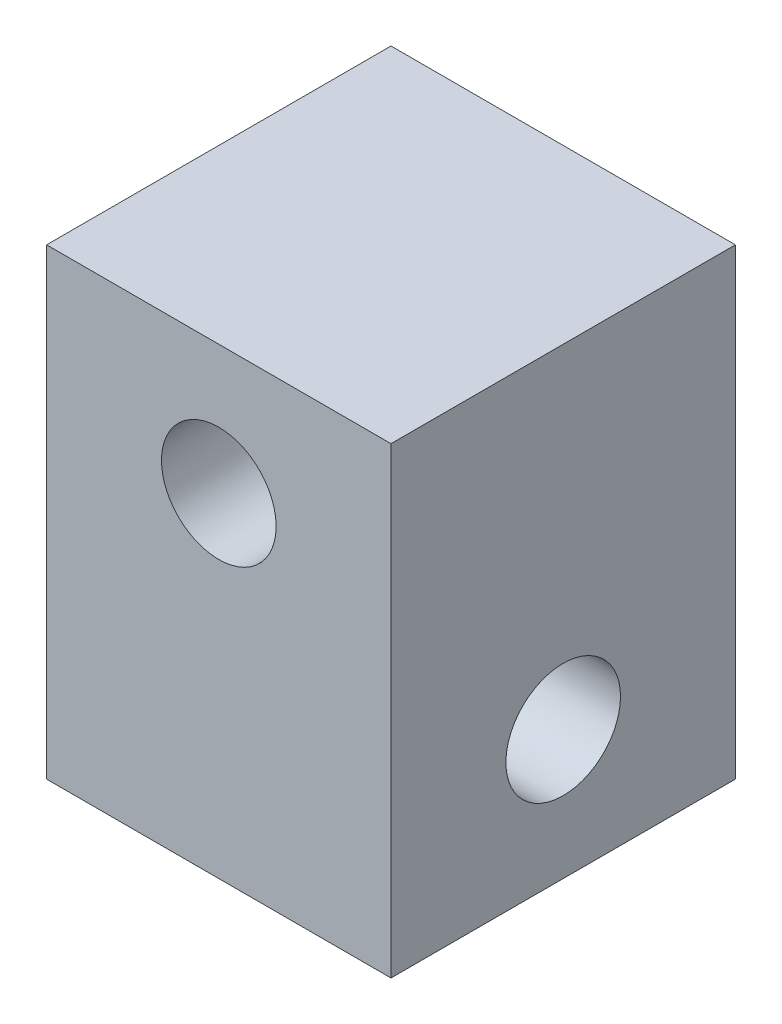
ISO-10303-21;
HEADER;
FILE_DESCRIPTION(('STEP AP214'),'2;1');
FILE_NAME('part.step','',(''),(''),'','','');
FILE_SCHEMA(('AUTOMOTIVE_DESIGN { 1 0 10303 214 1 1 1 1 }'));
ENDSEC;
DATA;
#1=APPLICATION_CONTEXT('core data for automotive mechanical design processes');
#2=APPLICATION_PROTOCOL_DEFINITION('international standard','automotive_design',2000,#1);
#3=PRODUCT_CONTEXT('',#1,'mechanical');
#4=PRODUCT('Part','Part','',(#3));
#5=PRODUCT_RELATED_PRODUCT_CATEGORY('part','',(#4));
#6=PRODUCT_DEFINITION_FORMATION('','',#4);
#7=PRODUCT_DEFINITION_CONTEXT('part definition',#1,'design');
#8=PRODUCT_DEFINITION('design','',#6,#7);
#9=PRODUCT_DEFINITION_SHAPE('','',#8);
#10=(LENGTH_UNIT() NAMED_UNIT(*) SI_UNIT(.MILLI.,.METRE.));
#11=(NAMED_UNIT(*) PLANE_ANGLE_UNIT() SI_UNIT($,.RADIAN.));
#12=(NAMED_UNIT(*) SI_UNIT($,.STERADIAN.) SOLID_ANGLE_UNIT());
#13=UNCERTAINTY_MEASURE_WITH_UNIT(LENGTH_MEASURE(1.E-05),#10,'distance_accuracy_value','');
#14=(GEOMETRIC_REPRESENTATION_CONTEXT(3) GLOBAL_UNCERTAINTY_ASSIGNED_CONTEXT((#13)) GLOBAL_UNIT_ASSIGNED_CONTEXT((#10,
#11,#12)) REPRESENTATION_CONTEXT('',''));
#15=CARTESIAN_POINT('',(0.,0.,0.));
#16=DIRECTION('',(0.,0.,1.));
#17=DIRECTION('',(1.,0.,0.));
#18=AXIS2_PLACEMENT_3D('',#15,#16,#17);
#19=CARTESIAN_POINT('',(4.064,0.,-4.064));
#20=DIRECTION('',(0.,-1.,0.));
#21=DIRECTION('',(0.,0.,-1.));
#22=AXIS2_PLACEMENT_3D('',#19,#20,#21);
#23=PLANE('',#22);
#24=DIRECTION('',(0.,0.,1.));
#25=VECTOR('',#24,1.);
#26=CARTESIAN_POINT('',(-4.064,0.,-4.064));
#27=LINE('',#26,#25);
#28=CARTESIAN_POINT('',(-4.064,0.,-4.064));
#29=VERTEX_POINT('',#28);
#30=CARTESIAN_POINT('',(-4.064,0.,4.064));
#31=VERTEX_POINT('',#30);
#32=EDGE_CURVE('E97',#29,#31,#27,.T.);
#33=ORIENTED_EDGE('',*,*,#32,.F.);
#34=DIRECTION('',(-1.,0.,0.));
#35=VECTOR('',#34,1.);
#36=CARTESIAN_POINT('',(4.064,0.,-4.064));
#37=LINE('',#36,#35);
#38=CARTESIAN_POINT('',(4.064,0.,-4.064));
#39=VERTEX_POINT('',#38);
#40=EDGE_CURVE('E11',#39,#29,#37,.T.);
#41=ORIENTED_EDGE('',*,*,#40,.F.);
#42=DIRECTION('',(0.,0.,1.));
#43=VECTOR('',#42,1.);
#44=CARTESIAN_POINT('',(4.064,0.,-4.064));
#45=LINE('',#44,#43);
#46=CARTESIAN_POINT('',(4.064,0.,4.064));
#47=VERTEX_POINT('',#46);
#48=EDGE_CURVE('E90',#39,#47,#45,.T.);
#49=ORIENTED_EDGE('',*,*,#48,.T.);
#50=DIRECTION('',(-1.,0.,0.));
#51=VECTOR('',#50,1.);
#52=CARTESIAN_POINT('',(4.064,0.,4.064));
#53=LINE('',#52,#51);
#54=EDGE_CURVE('E35',#47,#31,#53,.T.);
#55=ORIENTED_EDGE('',*,*,#54,.T.);
#56=EDGE_LOOP('',(#33,#41,#49,#55));
#57=FACE_BOUND('',#56,.T.);
#58=ADVANCED_FACE('F32',(#57),#23,.T.);
#59=CARTESIAN_POINT('',(4.064,10.922,-4.064));
#60=DIRECTION('',(0.,0.,-1.));
#61=DIRECTION('',(-1.,0.,0.));
#62=AXIS2_PLACEMENT_3D('',#59,#60,#61);
#63=PLANE('',#62);
#64=CARTESIAN_POINT('',(0.,7.874,-4.064));
#65=DIRECTION('',(0.,0.,1.));
#66=DIRECTION('',(1.,0.,0.));
#67=AXIS2_PLACEMENT_3D('',#64,#65,#66);
#68=CIRCLE('',#67,1.35254999999998);
#69=CARTESIAN_POINT('',(1.35254999999998,7.874,-4.064));
#70=VERTEX_POINT('',#69);
#71=EDGE_CURVE('E130',#70,#70,#68,.T.);
#72=ORIENTED_EDGE('',*,*,#71,.T.);
#73=EDGE_LOOP('',(#72));
#74=FACE_BOUND('',#73,.T.);
#75=DIRECTION('',(0.,-1.,0.));
#76=VECTOR('',#75,1.);
#77=CARTESIAN_POINT('',(-4.064,10.922,-4.064));
#78=LINE('',#77,#76);
#79=CARTESIAN_POINT('',(-4.064,10.922,-4.064));
#80=VERTEX_POINT('',#79);
#81=EDGE_CURVE('E92',#80,#29,#78,.T.);
#82=ORIENTED_EDGE('',*,*,#81,.F.);
#83=DIRECTION('',(-1.,0.,0.));
#84=VECTOR('',#83,1.);
#85=CARTESIAN_POINT('',(4.064,10.922,-4.064));
#86=LINE('',#85,#84);
#87=CARTESIAN_POINT('',(4.064,10.922,-4.064));
#88=VERTEX_POINT('',#87);
#89=EDGE_CURVE('E41',#88,#80,#86,.T.);
#90=ORIENTED_EDGE('',*,*,#89,.F.);
#91=DIRECTION('',(0.,-1.,0.));
#92=VECTOR('',#91,1.);
#93=CARTESIAN_POINT('',(4.064,10.922,-4.064));
#94=LINE('',#93,#92);
#95=EDGE_CURVE('E87',#88,#39,#94,.T.);
#96=ORIENTED_EDGE('',*,*,#95,.T.);
#97=ORIENTED_EDGE('',*,*,#40,.T.);
#98=EDGE_LOOP('',(#82,#90,#96,#97));
#99=FACE_BOUND('',#98,.T.);
#100=ADVANCED_FACE('F108',(#74,#99),#63,.T.);
#101=CARTESIAN_POINT('',(4.064,10.922,4.064));
#102=DIRECTION('',(0.,1.,0.));
#103=DIRECTION('',(0.,0.,1.));
#104=AXIS2_PLACEMENT_3D('',#101,#102,#103);
#105=PLANE('',#104);
#106=DIRECTION('',(0.,0.,-1.));
#107=VECTOR('',#106,1.);
#108=CARTESIAN_POINT('',(-4.064,10.922,4.064));
#109=LINE('',#108,#107);
#110=CARTESIAN_POINT('',(-4.064,10.922,4.064));
#111=VERTEX_POINT('',#110);
#112=EDGE_CURVE('E82',#111,#80,#109,.T.);
#113=ORIENTED_EDGE('',*,*,#112,.F.);
#114=DIRECTION('',(-1.,0.,0.));
#115=VECTOR('',#114,1.);
#116=CARTESIAN_POINT('',(4.064,10.922,4.064));
#117=LINE('',#116,#115);
#118=CARTESIAN_POINT('',(4.064,10.922,4.064));
#119=VERTEX_POINT('',#118);
#120=EDGE_CURVE('E77',#119,#111,#117,.T.);
#121=ORIENTED_EDGE('',*,*,#120,.F.);
#122=DIRECTION('',(0.,0.,-1.));
#123=VECTOR('',#122,1.);
#124=CARTESIAN_POINT('',(4.064,10.922,4.064));
#125=LINE('',#124,#123);
#126=EDGE_CURVE('E80',#119,#88,#125,.T.);
#127=ORIENTED_EDGE('',*,*,#126,.T.);
#128=ORIENTED_EDGE('',*,*,#89,.T.);
#129=EDGE_LOOP('',(#113,#121,#127,#128));
#130=FACE_BOUND('',#129,.T.);
#131=ADVANCED_FACE('F79',(#130),#105,.T.);
#132=CARTESIAN_POINT('',(4.064,0.,4.064));
#133=DIRECTION('',(0.,0.,1.));
#134=DIRECTION('',(1.,0.,0.));
#135=AXIS2_PLACEMENT_3D('',#132,#133,#134);
#136=PLANE('',#135);
#137=CARTESIAN_POINT('',(0.,7.874,4.064));
#138=DIRECTION('',(0.,0.,1.));
#139=DIRECTION('',(1.,0.,0.));
#140=AXIS2_PLACEMENT_3D('',#137,#138,#139);
#141=CIRCLE('',#140,1.35254999999998);
#142=CARTESIAN_POINT('',(1.35254999999998,7.874,4.064));
#143=VERTEX_POINT('',#142);
#144=EDGE_CURVE('E128',#143,#143,#141,.T.);
#145=ORIENTED_EDGE('',*,*,#144,.F.);
#146=EDGE_LOOP('',(#145));
#147=FACE_BOUND('',#146,.T.);
#148=DIRECTION('',(0.,1.,0.));
#149=VECTOR('',#148,1.);
#150=CARTESIAN_POINT('',(-4.064,0.,4.064));
#151=LINE('',#150,#149);
#152=EDGE_CURVE('E100',#31,#111,#151,.T.);
#153=ORIENTED_EDGE('',*,*,#152,.F.);
#154=ORIENTED_EDGE('',*,*,#54,.F.);
#155=DIRECTION('',(0.,1.,0.));
#156=VECTOR('',#155,1.);
#157=CARTESIAN_POINT('',(4.064,0.,4.064));
#158=LINE('',#157,#156);
#159=EDGE_CURVE('E86',#47,#119,#158,.T.);
#160=ORIENTED_EDGE('',*,*,#159,.T.);
#161=ORIENTED_EDGE('',*,*,#120,.T.);
#162=EDGE_LOOP('',(#153,#154,#160,#161));
#163=FACE_BOUND('',#162,.T.);
#164=ADVANCED_FACE('F89',(#147,#163),#136,.T.);
#165=CARTESIAN_POINT('',(4.064,0.,0.));
#166=DIRECTION('',(-1.,0.,0.));
#167=DIRECTION('',(0.,0.,1.));
#168=AXIS2_PLACEMENT_3D('',#165,#166,#167);
#169=PLANE('',#168);
#170=CARTESIAN_POINT('',(4.064,3.048,0.));
#171=DIRECTION('',(1.,0.,0.));
#172=DIRECTION('',(0.,0.,-1.));
#173=AXIS2_PLACEMENT_3D('',#170,#171,#172);
#174=CIRCLE('',#173,1.35254999999998);
#175=CARTESIAN_POINT('',(4.064,3.048,-1.35254999999998));
#176=VERTEX_POINT('',#175);
#177=EDGE_CURVE('E132',#176,#176,#174,.T.);
#178=ORIENTED_EDGE('',*,*,#177,.F.);
#179=EDGE_LOOP('',(#178));
#180=FACE_BOUND('',#179,.T.);
#181=ORIENTED_EDGE('',*,*,#48,.F.);
#182=ORIENTED_EDGE('',*,*,#95,.F.);
#183=ORIENTED_EDGE('',*,*,#126,.F.);
#184=ORIENTED_EDGE('',*,*,#159,.F.);
#185=EDGE_LOOP('',(#181,#182,#183,#184));
#186=FACE_BOUND('',#185,.T.);
#187=ADVANCED_FACE('F85',(#180,#186),#169,.F.);
#188=CARTESIAN_POINT('',(-4.064,0.,0.));
#189=DIRECTION('',(-1.,0.,0.));
#190=DIRECTION('',(0.,0.,1.));
#191=AXIS2_PLACEMENT_3D('',#188,#189,#190);
#192=PLANE('',#191);
#193=CARTESIAN_POINT('',(-4.064,3.048,0.));
#194=DIRECTION('',(1.,0.,0.));
#195=DIRECTION('',(0.,0.,-1.));
#196=AXIS2_PLACEMENT_3D('',#193,#194,#195);
#197=CIRCLE('',#196,1.35254999999998);
#198=CARTESIAN_POINT('',(-4.064,3.048,-1.35254999999998));
#199=VERTEX_POINT('',#198);
#200=EDGE_CURVE('E101',#199,#199,#197,.T.);
#201=ORIENTED_EDGE('',*,*,#200,.T.);
#202=EDGE_LOOP('',(#201));
#203=FACE_BOUND('',#202,.T.);
#204=ORIENTED_EDGE('',*,*,#32,.T.);
#205=ORIENTED_EDGE('',*,*,#152,.T.);
#206=ORIENTED_EDGE('',*,*,#112,.T.);
#207=ORIENTED_EDGE('',*,*,#81,.T.);
#208=EDGE_LOOP('',(#204,#205,#206,#207));
#209=FACE_BOUND('',#208,.T.);
#210=ADVANCED_FACE('F107',(#203,#209),#192,.T.);
#211=CARTESIAN_POINT('',(4.064,3.048,0.));
#212=DIRECTION('',(1.,0.,0.));
#213=DIRECTION('',(0.,0.,-1.));
#214=AXIS2_PLACEMENT_3D('',#211,#212,#213);
#215=CYLINDRICAL_SURFACE('',#214,1.35254999999998);
#216=ORIENTED_EDGE('',*,*,#200,.F.);
#217=EDGE_LOOP('',(#216));
#218=FACE_BOUND('',#217,.T.);
#219=ORIENTED_EDGE('',*,*,#177,.T.);
#220=EDGE_LOOP('',(#219));
#221=FACE_BOUND('',#220,.T.);
#222=ADVANCED_FACE('F140',(#218,#221),#215,.F.);
#223=CARTESIAN_POINT('',(0.,7.874,4.064));
#224=DIRECTION('',(0.,0.,1.));
#225=DIRECTION('',(1.,0.,0.));
#226=AXIS2_PLACEMENT_3D('',#223,#224,#225);
#227=CYLINDRICAL_SURFACE('',#226,1.35254999999998);
#228=ORIENTED_EDGE('',*,*,#71,.F.);
#229=EDGE_LOOP('',(#228));
#230=FACE_BOUND('',#229,.T.);
#231=ORIENTED_EDGE('',*,*,#144,.T.);
#232=EDGE_LOOP('',(#231));
#233=FACE_BOUND('',#232,.T.);
#234=ADVANCED_FACE('F143',(#230,#233),#227,.F.);
#235=CLOSED_SHELL('',(#58,#100,#131,#164,#187,#210,#222,#234));
#236=MANIFOLD_SOLID_BREP('B2',#235);
#237=ADVANCED_BREP_SHAPE_REPRESENTATION('',(#18,#236),#14);
#238=SHAPE_DEFINITION_REPRESENTATION(#9,#237);
ENDSEC;
END-ISO-10303-21;
